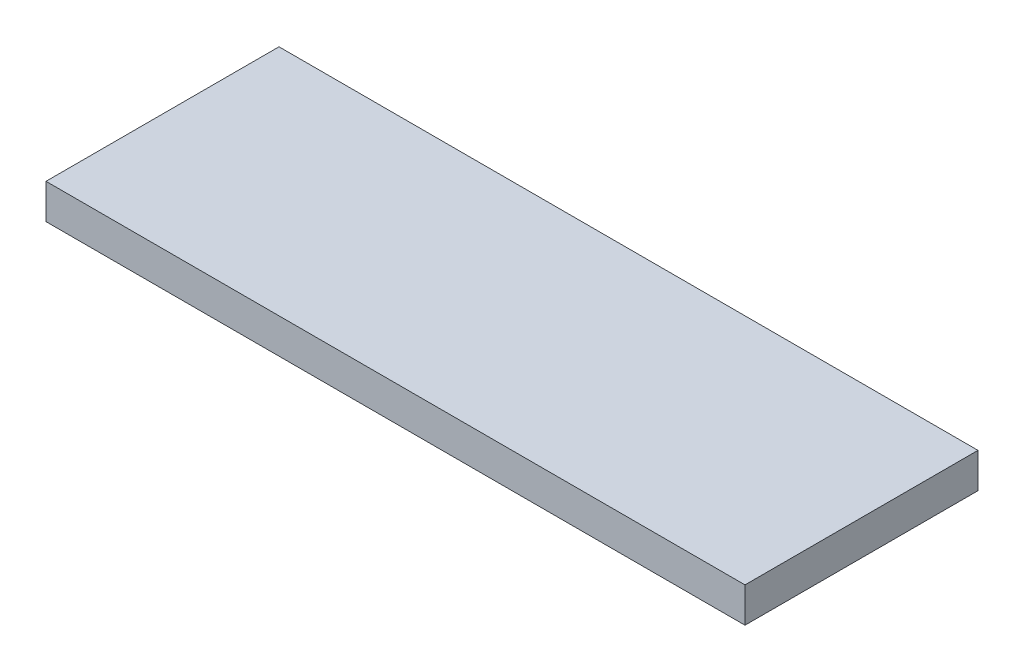
ISO-10303-21;
HEADER;
FILE_DESCRIPTION(('STEP AP214'),'2;1');
FILE_NAME('part.step','',(''),(''),'','','');
FILE_SCHEMA(('AUTOMOTIVE_DESIGN { 1 0 10303 214 1 1 1 1 }'));
ENDSEC;
DATA;
#1=APPLICATION_CONTEXT('core data for automotive mechanical design processes');
#2=APPLICATION_PROTOCOL_DEFINITION('international standard','automotive_design',2000,#1);
#3=PRODUCT_CONTEXT('',#1,'mechanical');
#4=PRODUCT('Part','Part','',(#3));
#5=PRODUCT_RELATED_PRODUCT_CATEGORY('part','',(#4));
#6=PRODUCT_DEFINITION_FORMATION('','',#4);
#7=PRODUCT_DEFINITION_CONTEXT('part definition',#1,'design');
#8=PRODUCT_DEFINITION('design','',#6,#7);
#9=PRODUCT_DEFINITION_SHAPE('','',#8);
#10=(LENGTH_UNIT() NAMED_UNIT(*) SI_UNIT(.MILLI.,.METRE.));
#11=(NAMED_UNIT(*) PLANE_ANGLE_UNIT() SI_UNIT($,.RADIAN.));
#12=(NAMED_UNIT(*) SI_UNIT($,.STERADIAN.) SOLID_ANGLE_UNIT());
#13=UNCERTAINTY_MEASURE_WITH_UNIT(LENGTH_MEASURE(1.E-05),#10,'distance_accuracy_value','');
#14=(GEOMETRIC_REPRESENTATION_CONTEXT(3) GLOBAL_UNCERTAINTY_ASSIGNED_CONTEXT((#13)) GLOBAL_UNIT_ASSIGNED_CONTEXT((#10,
#11,#12)) REPRESENTATION_CONTEXT('',''));
#15=CARTESIAN_POINT('',(0.,0.,0.));
#16=DIRECTION('',(0.,0.,1.));
#17=DIRECTION('',(1.,0.,0.));
#18=AXIS2_PLACEMENT_3D('',#15,#16,#17);
#19=CARTESIAN_POINT('',(30.,3.,-10.));
#20=DIRECTION('',(-1.,0.,0.));
#21=DIRECTION('',(0.,0.,1.));
#22=AXIS2_PLACEMENT_3D('',#19,#20,#21);
#23=PLANE('',#22);
#24=DIRECTION('',(0.,0.,-1.));
#25=VECTOR('',#24,1.);
#26=CARTESIAN_POINT('',(30.,0.,-10.));
#27=LINE('',#26,#25);
#28=CARTESIAN_POINT('',(30.,0.,10.));
#29=VERTEX_POINT('',#28);
#30=CARTESIAN_POINT('',(30.,0.,-10.));
#31=VERTEX_POINT('',#30);
#32=EDGE_CURVE('E99',#29,#31,#27,.T.);
#33=ORIENTED_EDGE('',*,*,#32,.T.);
#34=DIRECTION('',(0.,-1.,0.));
#35=VECTOR('',#34,1.);
#36=CARTESIAN_POINT('',(30.,3.,-10.));
#37=LINE('',#36,#35);
#38=CARTESIAN_POINT('',(30.,3.,-10.));
#39=VERTEX_POINT('',#38);
#40=EDGE_CURVE('E11',#39,#31,#37,.T.);
#41=ORIENTED_EDGE('',*,*,#40,.F.);
#42=DIRECTION('',(0.,0.,-1.));
#43=VECTOR('',#42,1.);
#44=CARTESIAN_POINT('',(30.,3.,-10.));
#45=LINE('',#44,#43);
#46=CARTESIAN_POINT('',(30.,3.,10.));
#47=VERTEX_POINT('',#46);
#48=EDGE_CURVE('E87',#47,#39,#45,.T.);
#49=ORIENTED_EDGE('',*,*,#48,.F.);
#50=DIRECTION('',(0.,-1.,0.));
#51=VECTOR('',#50,1.);
#52=CARTESIAN_POINT('',(30.,3.,10.));
#53=LINE('',#52,#51);
#54=EDGE_CURVE('E95',#47,#29,#53,.T.);
#55=ORIENTED_EDGE('',*,*,#54,.T.);
#56=EDGE_LOOP('',(#33,#41,#49,#55));
#57=FACE_BOUND('',#56,.T.);
#58=ADVANCED_FACE('F36',(#57),#23,.F.);
#59=CARTESIAN_POINT('',(-30.,3.,-10.));
#60=DIRECTION('',(0.,0.,1.));
#61=DIRECTION('',(1.,0.,0.));
#62=AXIS2_PLACEMENT_3D('',#59,#60,#61);
#63=PLANE('',#62);
#64=DIRECTION('',(-1.,0.,0.));
#65=VECTOR('',#64,1.);
#66=CARTESIAN_POINT('',(-30.,0.,-10.));
#67=LINE('',#66,#65);
#68=CARTESIAN_POINT('',(-30.,0.,-10.));
#69=VERTEX_POINT('',#68);
#70=EDGE_CURVE('E91',#31,#69,#67,.T.);
#71=ORIENTED_EDGE('',*,*,#70,.T.);
#72=DIRECTION('',(0.,-1.,0.));
#73=VECTOR('',#72,1.);
#74=CARTESIAN_POINT('',(-30.,3.,-10.));
#75=LINE('',#74,#73);
#76=CARTESIAN_POINT('',(-30.,3.,-10.));
#77=VERTEX_POINT('',#76);
#78=EDGE_CURVE('E44',#77,#69,#75,.T.);
#79=ORIENTED_EDGE('',*,*,#78,.F.);
#80=DIRECTION('',(-1.,0.,0.));
#81=VECTOR('',#80,1.);
#82=CARTESIAN_POINT('',(-30.,3.,-10.));
#83=LINE('',#82,#81);
#84=EDGE_CURVE('E82',#39,#77,#83,.T.);
#85=ORIENTED_EDGE('',*,*,#84,.F.);
#86=ORIENTED_EDGE('',*,*,#40,.T.);
#87=EDGE_LOOP('',(#71,#79,#85,#86));
#88=FACE_BOUND('',#87,.T.);
#89=ADVANCED_FACE('F90',(#88),#63,.F.);
#90=CARTESIAN_POINT('',(-30.,3.,-10.));
#91=DIRECTION('',(1.,0.,0.));
#92=DIRECTION('',(0.,0.,-1.));
#93=AXIS2_PLACEMENT_3D('',#90,#91,#92);
#94=PLANE('',#93);
#95=DIRECTION('',(0.,0.,1.));
#96=VECTOR('',#95,1.);
#97=CARTESIAN_POINT('',(-30.,0.,-10.));
#98=LINE('',#97,#96);
#99=CARTESIAN_POINT('',(-30.,0.,10.));
#100=VERTEX_POINT('',#99);
#101=EDGE_CURVE('E69',#69,#100,#98,.T.);
#102=ORIENTED_EDGE('',*,*,#101,.T.);
#103=DIRECTION('',(0.,-1.,0.));
#104=VECTOR('',#103,1.);
#105=CARTESIAN_POINT('',(-30.,3.,10.));
#106=LINE('',#105,#104);
#107=CARTESIAN_POINT('',(-30.,3.,10.));
#108=VERTEX_POINT('',#107);
#109=EDGE_CURVE('E92',#108,#100,#106,.T.);
#110=ORIENTED_EDGE('',*,*,#109,.F.);
#111=DIRECTION('',(0.,0.,1.));
#112=VECTOR('',#111,1.);
#113=CARTESIAN_POINT('',(-30.,3.,-10.));
#114=LINE('',#113,#112);
#115=EDGE_CURVE('E85',#77,#108,#114,.T.);
#116=ORIENTED_EDGE('',*,*,#115,.F.);
#117=ORIENTED_EDGE('',*,*,#78,.T.);
#118=EDGE_LOOP('',(#102,#110,#116,#117));
#119=FACE_BOUND('',#118,.T.);
#120=ADVANCED_FACE('F93',(#119),#94,.F.);
#121=CARTESIAN_POINT('',(-30.,3.,10.));
#122=DIRECTION('',(0.,0.,-1.));
#123=DIRECTION('',(-1.,0.,0.));
#124=AXIS2_PLACEMENT_3D('',#121,#122,#123);
#125=PLANE('',#124);
#126=DIRECTION('',(1.,0.,0.));
#127=VECTOR('',#126,1.);
#128=CARTESIAN_POINT('',(-30.,0.,10.));
#129=LINE('',#128,#127);
#130=EDGE_CURVE('E75',#100,#29,#129,.T.);
#131=ORIENTED_EDGE('',*,*,#130,.T.);
#132=ORIENTED_EDGE('',*,*,#54,.F.);
#133=DIRECTION('',(1.,0.,0.));
#134=VECTOR('',#133,1.);
#135=CARTESIAN_POINT('',(-30.,3.,10.));
#136=LINE('',#135,#134);
#137=EDGE_CURVE('E52',#108,#47,#136,.T.);
#138=ORIENTED_EDGE('',*,*,#137,.F.);
#139=ORIENTED_EDGE('',*,*,#109,.T.);
#140=EDGE_LOOP('',(#131,#132,#138,#139));
#141=FACE_BOUND('',#140,.T.);
#142=ADVANCED_FACE('F106',(#141),#125,.F.);
#143=CARTESIAN_POINT('',(0.,3.,0.));
#144=DIRECTION('',(0.,1.,0.));
#145=DIRECTION('',(0.,0.,1.));
#146=AXIS2_PLACEMENT_3D('',#143,#144,#145);
#147=PLANE('',#146);
#148=ORIENTED_EDGE('',*,*,#48,.T.);
#149=ORIENTED_EDGE('',*,*,#84,.T.);
#150=ORIENTED_EDGE('',*,*,#115,.T.);
#151=ORIENTED_EDGE('',*,*,#137,.T.);
#152=EDGE_LOOP('',(#148,#149,#150,#151));
#153=FACE_BOUND('',#152,.T.);
#154=ADVANCED_FACE('F83',(#153),#147,.T.);
#155=CARTESIAN_POINT('',(0.,0.,0.));
#156=DIRECTION('',(0.,1.,0.));
#157=DIRECTION('',(0.,0.,1.));
#158=AXIS2_PLACEMENT_3D('',#155,#156,#157);
#159=PLANE('',#158);
#160=ORIENTED_EDGE('',*,*,#32,.F.);
#161=ORIENTED_EDGE('',*,*,#130,.F.);
#162=ORIENTED_EDGE('',*,*,#101,.F.);
#163=ORIENTED_EDGE('',*,*,#70,.F.);
#164=EDGE_LOOP('',(#160,#161,#162,#163));
#165=FACE_BOUND('',#164,.T.);
#166=ADVANCED_FACE('F109',(#165),#159,.F.);
#167=CLOSED_SHELL('',(#58,#89,#120,#142,#154,#166));
#168=MANIFOLD_SOLID_BREP('B2',#167);
#169=ADVANCED_BREP_SHAPE_REPRESENTATION('',(#18,#168),#14);
#170=SHAPE_DEFINITION_REPRESENTATION(#9,#169);
ENDSEC;
END-ISO-10303-21;
